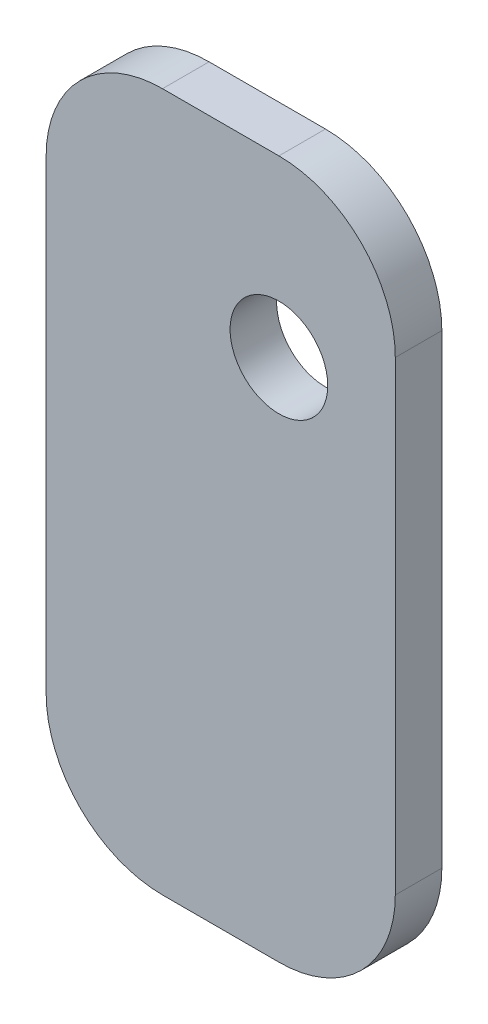
ISO-10303-21;
HEADER;
FILE_DESCRIPTION(('STEP AP214'),'2;1');
FILE_NAME('part.step','',(''),(''),'','','');
FILE_SCHEMA(('AUTOMOTIVE_DESIGN { 1 0 10303 214 1 1 1 1 }'));
ENDSEC;
DATA;
#1=APPLICATION_CONTEXT('core data for automotive mechanical design processes');
#2=APPLICATION_PROTOCOL_DEFINITION('international standard','automotive_design',2000,#1);
#3=PRODUCT_CONTEXT('',#1,'mechanical');
#4=PRODUCT('Part','Part','',(#3));
#5=PRODUCT_RELATED_PRODUCT_CATEGORY('part','',(#4));
#6=PRODUCT_DEFINITION_FORMATION('','',#4);
#7=PRODUCT_DEFINITION_CONTEXT('part definition',#1,'design');
#8=PRODUCT_DEFINITION('design','',#6,#7);
#9=PRODUCT_DEFINITION_SHAPE('','',#8);
#10=(LENGTH_UNIT() NAMED_UNIT(*) SI_UNIT(.MILLI.,.METRE.));
#11=(NAMED_UNIT(*) PLANE_ANGLE_UNIT() SI_UNIT($,.RADIAN.));
#12=(NAMED_UNIT(*) SI_UNIT($,.STERADIAN.) SOLID_ANGLE_UNIT());
#13=UNCERTAINTY_MEASURE_WITH_UNIT(LENGTH_MEASURE(1.E-05),#10,'distance_accuracy_value','');
#14=(GEOMETRIC_REPRESENTATION_CONTEXT(3) GLOBAL_UNCERTAINTY_ASSIGNED_CONTEXT((#13)) GLOBAL_UNIT_ASSIGNED_CONTEXT((#10,
#11,#12)) REPRESENTATION_CONTEXT('',''));
#15=CARTESIAN_POINT('',(0.,0.,0.));
#16=DIRECTION('',(0.,0.,1.));
#17=DIRECTION('',(1.,0.,0.));
#18=AXIS2_PLACEMENT_3D('',#15,#16,#17);
#19=CARTESIAN_POINT('',(-15.,-30.,4.));
#20=DIRECTION('',(1.,0.,0.));
#21=DIRECTION('',(0.,0.,-1.));
#22=AXIS2_PLACEMENT_3D('',#19,#20,#21);
#23=PLANE('',#22);
#24=DIRECTION('',(0.,-1.,0.));
#25=VECTOR('',#24,1.);
#26=CARTESIAN_POINT('',(-15.,-30.,4.));
#27=LINE('',#26,#25);
#28=CARTESIAN_POINT('',(-15.,20.,4.));
#29=VERTEX_POINT('',#28);
#30=CARTESIAN_POINT('',(-15.,-20.,4.));
#31=VERTEX_POINT('',#30);
#32=EDGE_CURVE('E118',#29,#31,#27,.T.);
#33=ORIENTED_EDGE('',*,*,#32,.F.);
#34=DIRECTION('',(0.,0.,-1.));
#35=VECTOR('',#34,1.);
#36=CARTESIAN_POINT('',(-15.,20.,4.));
#37=LINE('',#36,#35);
#38=CARTESIAN_POINT('',(-15.,20.,0.));
#39=VERTEX_POINT('',#38);
#40=EDGE_CURVE('E103',#29,#39,#37,.T.);
#41=ORIENTED_EDGE('',*,*,#40,.T.);
#42=DIRECTION('',(0.,-1.,0.));
#43=VECTOR('',#42,1.);
#44=CARTESIAN_POINT('',(-15.,-30.,0.));
#45=LINE('',#44,#43);
#46=CARTESIAN_POINT('',(-15.,-20.,0.));
#47=VERTEX_POINT('',#46);
#48=EDGE_CURVE('E115',#39,#47,#45,.T.);
#49=ORIENTED_EDGE('',*,*,#48,.T.);
#50=DIRECTION('',(0.,0.,-1.));
#51=VECTOR('',#50,1.);
#52=CARTESIAN_POINT('',(-15.,-20.,4.));
#53=LINE('',#52,#51);
#54=EDGE_CURVE('E120',#47,#31,#53,.F.);
#55=ORIENTED_EDGE('',*,*,#54,.T.);
#56=EDGE_LOOP('',(#33,#41,#49,#55));
#57=FACE_BOUND('',#56,.T.);
#58=ADVANCED_FACE('F33',(#57),#23,.F.);
#59=CARTESIAN_POINT('',(15.,-30.,4.));
#60=DIRECTION('',(0.,1.,0.));
#61=DIRECTION('',(0.,0.,1.));
#62=AXIS2_PLACEMENT_3D('',#59,#60,#61);
#63=PLANE('',#62);
#64=DIRECTION('',(1.,0.,0.));
#65=VECTOR('',#64,1.);
#66=CARTESIAN_POINT('',(15.,-30.,4.));
#67=LINE('',#66,#65);
#68=CARTESIAN_POINT('',(-5.,-30.,4.));
#69=VERTEX_POINT('',#68);
#70=CARTESIAN_POINT('',(5.,-30.,4.));
#71=VERTEX_POINT('',#70);
#72=EDGE_CURVE('E164',#69,#71,#67,.T.);
#73=ORIENTED_EDGE('',*,*,#72,.F.);
#74=DIRECTION('',(0.,0.,-1.));
#75=VECTOR('',#74,1.);
#76=CARTESIAN_POINT('',(-5.,-30.,4.));
#77=LINE('',#76,#75);
#78=CARTESIAN_POINT('',(-5.,-30.,0.));
#79=VERTEX_POINT('',#78);
#80=EDGE_CURVE('E157',#69,#79,#77,.T.);
#81=ORIENTED_EDGE('',*,*,#80,.T.);
#82=DIRECTION('',(1.,0.,0.));
#83=VECTOR('',#82,1.);
#84=CARTESIAN_POINT('',(15.,-30.,0.));
#85=LINE('',#84,#83);
#86=CARTESIAN_POINT('',(5.,-30.,0.));
#87=VERTEX_POINT('',#86);
#88=EDGE_CURVE('E124',#79,#87,#85,.T.);
#89=ORIENTED_EDGE('',*,*,#88,.T.);
#90=DIRECTION('',(0.,0.,-1.));
#91=VECTOR('',#90,1.);
#92=CARTESIAN_POINT('',(5.,-30.,4.));
#93=LINE('',#92,#91);
#94=EDGE_CURVE('E155',#87,#71,#93,.F.);
#95=ORIENTED_EDGE('',*,*,#94,.T.);
#96=EDGE_LOOP('',(#73,#81,#89,#95));
#97=FACE_BOUND('',#96,.T.);
#98=ADVANCED_FACE('F162',(#97),#63,.F.);
#99=CARTESIAN_POINT('',(15.,-30.,4.));
#100=DIRECTION('',(-1.,0.,0.));
#101=DIRECTION('',(0.,0.,1.));
#102=AXIS2_PLACEMENT_3D('',#99,#100,#101);
#103=PLANE('',#102);
#104=DIRECTION('',(0.,1.,0.));
#105=VECTOR('',#104,1.);
#106=CARTESIAN_POINT('',(15.,-30.,4.));
#107=LINE('',#106,#105);
#108=CARTESIAN_POINT('',(15.,-20.,4.));
#109=VERTEX_POINT('',#108);
#110=CARTESIAN_POINT('',(15.,20.,4.));
#111=VERTEX_POINT('',#110);
#112=EDGE_CURVE('E172',#109,#111,#107,.T.);
#113=ORIENTED_EDGE('',*,*,#112,.F.);
#114=DIRECTION('',(0.,0.,-1.));
#115=VECTOR('',#114,1.);
#116=CARTESIAN_POINT('',(15.,-20.,4.));
#117=LINE('',#116,#115);
#118=CARTESIAN_POINT('',(15.,-20.,0.));
#119=VERTEX_POINT('',#118);
#120=EDGE_CURVE('E11',#109,#119,#117,.T.);
#121=ORIENTED_EDGE('',*,*,#120,.T.);
#122=DIRECTION('',(0.,1.,0.));
#123=VECTOR('',#122,1.);
#124=CARTESIAN_POINT('',(15.,-30.,0.));
#125=LINE('',#124,#123);
#126=CARTESIAN_POINT('',(15.,20.,0.));
#127=VERTEX_POINT('',#126);
#128=EDGE_CURVE('E128',#119,#127,#125,.T.);
#129=ORIENTED_EDGE('',*,*,#128,.T.);
#130=DIRECTION('',(0.,0.,-1.));
#131=VECTOR('',#130,1.);
#132=CARTESIAN_POINT('',(15.,20.,4.));
#133=LINE('',#132,#131);
#134=EDGE_CURVE('E41',#127,#111,#133,.F.);
#135=ORIENTED_EDGE('',*,*,#134,.T.);
#136=EDGE_LOOP('',(#113,#121,#129,#135));
#137=FACE_BOUND('',#136,.T.);
#138=ADVANCED_FACE('F171',(#137),#103,.F.);
#139=CARTESIAN_POINT('',(15.,30.,4.));
#140=DIRECTION('',(0.,-1.,0.));
#141=DIRECTION('',(0.,0.,-1.));
#142=AXIS2_PLACEMENT_3D('',#139,#140,#141);
#143=PLANE('',#142);
#144=DIRECTION('',(-1.,0.,0.));
#145=VECTOR('',#144,1.);
#146=CARTESIAN_POINT('',(15.,30.,0.));
#147=LINE('',#146,#145);
#148=CARTESIAN_POINT('',(5.,30.,0.));
#149=VERTEX_POINT('',#148);
#150=CARTESIAN_POINT('',(-5.,30.,0.));
#151=VERTEX_POINT('',#150);
#152=EDGE_CURVE('E138',#149,#151,#147,.T.);
#153=ORIENTED_EDGE('',*,*,#152,.T.);
#154=DIRECTION('',(0.,0.,-1.));
#155=VECTOR('',#154,1.);
#156=CARTESIAN_POINT('',(-5.,30.,4.));
#157=LINE('',#156,#155);
#158=CARTESIAN_POINT('',(-5.,30.,4.));
#159=VERTEX_POINT('',#158);
#160=EDGE_CURVE('E104',#151,#159,#157,.F.);
#161=ORIENTED_EDGE('',*,*,#160,.T.);
#162=DIRECTION('',(-1.,0.,0.));
#163=VECTOR('',#162,1.);
#164=CARTESIAN_POINT('',(15.,30.,4.));
#165=LINE('',#164,#163);
#166=CARTESIAN_POINT('',(5.,30.,4.));
#167=VERTEX_POINT('',#166);
#168=EDGE_CURVE('E134',#167,#159,#165,.T.);
#169=ORIENTED_EDGE('',*,*,#168,.F.);
#170=DIRECTION('',(0.,0.,-1.));
#171=VECTOR('',#170,1.);
#172=CARTESIAN_POINT('',(5.,30.,4.));
#173=LINE('',#172,#171);
#174=EDGE_CURVE('E109',#167,#149,#173,.T.);
#175=ORIENTED_EDGE('',*,*,#174,.T.);
#176=EDGE_LOOP('',(#153,#161,#169,#175));
#177=FACE_BOUND('',#176,.T.);
#178=ADVANCED_FACE('F185',(#177),#143,.F.);
#179=CARTESIAN_POINT('',(0.,0.,4.));
#180=DIRECTION('',(0.,0.,1.));
#181=DIRECTION('',(1.,0.,0.));
#182=AXIS2_PLACEMENT_3D('',#179,#180,#181);
#183=PLANE('',#182);
#184=CARTESIAN_POINT('',(5.,15.,4.));
#185=DIRECTION('',(0.,0.,1.));
#186=DIRECTION('',(1.,0.,0.));
#187=AXIS2_PLACEMENT_3D('',#184,#185,#186);
#188=CIRCLE('',#187,4.1950936586854);
#189=CARTESIAN_POINT('',(9.1950936586854,15.,4.));
#190=VERTEX_POINT('',#189);
#191=EDGE_CURVE('E131',#190,#190,#188,.T.);
#192=ORIENTED_EDGE('',*,*,#191,.F.);
#193=EDGE_LOOP('',(#192));
#194=FACE_BOUND('',#193,.T.);
#195=ORIENTED_EDGE('',*,*,#168,.T.);
#196=CARTESIAN_POINT('',(-5.,20.,4.));
#197=DIRECTION('',(0.,0.,1.));
#198=DIRECTION('',(1.,0.,0.));
#199=AXIS2_PLACEMENT_3D('',#196,#197,#198);
#200=CIRCLE('',#199,10.);
#201=EDGE_CURVE('E153',#159,#29,#200,.T.);
#202=ORIENTED_EDGE('',*,*,#201,.T.);
#203=ORIENTED_EDGE('',*,*,#32,.T.);
#204=CARTESIAN_POINT('',(-5.,-20.,4.));
#205=DIRECTION('',(0.,0.,1.));
#206=DIRECTION('',(1.,0.,0.));
#207=AXIS2_PLACEMENT_3D('',#204,#205,#206);
#208=CIRCLE('',#207,10.);
#209=EDGE_CURVE('E151',#31,#69,#208,.T.);
#210=ORIENTED_EDGE('',*,*,#209,.T.);
#211=ORIENTED_EDGE('',*,*,#72,.T.);
#212=CARTESIAN_POINT('',(5.,-20.,4.));
#213=DIRECTION('',(0.,0.,1.));
#214=DIRECTION('',(1.,0.,0.));
#215=AXIS2_PLACEMENT_3D('',#212,#213,#214);
#216=CIRCLE('',#215,10.);
#217=EDGE_CURVE('E54',#71,#109,#216,.T.);
#218=ORIENTED_EDGE('',*,*,#217,.T.);
#219=ORIENTED_EDGE('',*,*,#112,.T.);
#220=CARTESIAN_POINT('',(5.,20.,4.));
#221=DIRECTION('',(0.,0.,1.));
#222=DIRECTION('',(1.,0.,0.));
#223=AXIS2_PLACEMENT_3D('',#220,#221,#222);
#224=CIRCLE('',#223,10.);
#225=EDGE_CURVE('E148',#111,#167,#224,.T.);
#226=ORIENTED_EDGE('',*,*,#225,.T.);
#227=EDGE_LOOP('',(#195,#202,#203,#210,#211,#218,#219,#226));
#228=FACE_BOUND('',#227,.T.);
#229=ADVANCED_FACE('F183',(#194,#228),#183,.T.);
#230=CARTESIAN_POINT('',(0.,0.,0.));
#231=DIRECTION('',(0.,0.,1.));
#232=DIRECTION('',(1.,0.,0.));
#233=AXIS2_PLACEMENT_3D('',#230,#231,#232);
#234=PLANE('',#233);
#235=CARTESIAN_POINT('',(5.,15.,0.));
#236=DIRECTION('',(0.,0.,1.));
#237=DIRECTION('',(1.,0.,0.));
#238=AXIS2_PLACEMENT_3D('',#235,#236,#237);
#239=CIRCLE('',#238,4.1950936586854);
#240=CARTESIAN_POINT('',(9.1950936586854,15.,0.));
#241=VERTEX_POINT('',#240);
#242=EDGE_CURVE('E125',#241,#241,#239,.T.);
#243=ORIENTED_EDGE('',*,*,#242,.T.);
#244=EDGE_LOOP('',(#243));
#245=FACE_BOUND('',#244,.T.);
#246=ORIENTED_EDGE('',*,*,#48,.F.);
#247=CARTESIAN_POINT('',(-5.,20.,0.));
#248=DIRECTION('',(0.,0.,1.));
#249=DIRECTION('',(1.,0.,0.));
#250=AXIS2_PLACEMENT_3D('',#247,#248,#249);
#251=CIRCLE('',#250,10.);
#252=EDGE_CURVE('E99',#39,#151,#251,.F.);
#253=ORIENTED_EDGE('',*,*,#252,.T.);
#254=ORIENTED_EDGE('',*,*,#152,.F.);
#255=CARTESIAN_POINT('',(5.,20.,0.));
#256=DIRECTION('',(0.,0.,1.));
#257=DIRECTION('',(1.,0.,0.));
#258=AXIS2_PLACEMENT_3D('',#255,#256,#257);
#259=CIRCLE('',#258,10.);
#260=EDGE_CURVE('E119',#149,#127,#259,.F.);
#261=ORIENTED_EDGE('',*,*,#260,.T.);
#262=ORIENTED_EDGE('',*,*,#128,.F.);
#263=CARTESIAN_POINT('',(5.,-20.,0.));
#264=DIRECTION('',(0.,0.,1.));
#265=DIRECTION('',(1.,0.,0.));
#266=AXIS2_PLACEMENT_3D('',#263,#264,#265);
#267=CIRCLE('',#266,10.);
#268=EDGE_CURVE('E142',#119,#87,#267,.F.);
#269=ORIENTED_EDGE('',*,*,#268,.T.);
#270=ORIENTED_EDGE('',*,*,#88,.F.);
#271=CARTESIAN_POINT('',(-5.,-20.,0.));
#272=DIRECTION('',(0.,0.,1.));
#273=DIRECTION('',(1.,0.,0.));
#274=AXIS2_PLACEMENT_3D('',#271,#272,#273);
#275=CIRCLE('',#274,10.);
#276=EDGE_CURVE('E110',#79,#47,#275,.F.);
#277=ORIENTED_EDGE('',*,*,#276,.T.);
#278=EDGE_LOOP('',(#246,#253,#254,#261,#262,#269,#270,#277));
#279=FACE_BOUND('',#278,.T.);
#280=ADVANCED_FACE('F122',(#245,#279),#234,.F.);
#281=CARTESIAN_POINT('',(5.,15.,0.));
#282=DIRECTION('',(0.,0.,1.));
#283=DIRECTION('',(1.,0.,0.));
#284=AXIS2_PLACEMENT_3D('',#281,#282,#283);
#285=CYLINDRICAL_SURFACE('',#284,4.1950936586854);
#286=ORIENTED_EDGE('',*,*,#242,.F.);
#287=EDGE_LOOP('',(#286));
#288=FACE_BOUND('',#287,.T.);
#289=ORIENTED_EDGE('',*,*,#191,.T.);
#290=EDGE_LOOP('',(#289));
#291=FACE_BOUND('',#290,.T.);
#292=ADVANCED_FACE('F181',(#288,#291),#285,.F.);
#293=CARTESIAN_POINT('',(-5.,20.,4.));
#294=DIRECTION('',(0.,0.,-1.));
#295=DIRECTION('',(-1.,0.,0.));
#296=AXIS2_PLACEMENT_3D('',#293,#294,#295);
#297=CYLINDRICAL_SURFACE('',#296,10.);
#298=ORIENTED_EDGE('',*,*,#201,.F.);
#299=ORIENTED_EDGE('',*,*,#160,.F.);
#300=ORIENTED_EDGE('',*,*,#252,.F.);
#301=ORIENTED_EDGE('',*,*,#40,.F.);
#302=EDGE_LOOP('',(#298,#299,#300,#301));
#303=FACE_BOUND('',#302,.T.);
#304=ADVANCED_FACE('F102',(#303),#297,.T.);
#305=CARTESIAN_POINT('',(-5.,-20.,4.));
#306=DIRECTION('',(0.,0.,-1.));
#307=DIRECTION('',(-1.,0.,0.));
#308=AXIS2_PLACEMENT_3D('',#305,#306,#307);
#309=CYLINDRICAL_SURFACE('',#308,10.);
#310=ORIENTED_EDGE('',*,*,#209,.F.);
#311=ORIENTED_EDGE('',*,*,#54,.F.);
#312=ORIENTED_EDGE('',*,*,#276,.F.);
#313=ORIENTED_EDGE('',*,*,#80,.F.);
#314=EDGE_LOOP('',(#310,#311,#312,#313));
#315=FACE_BOUND('',#314,.T.);
#316=ADVANCED_FACE('F195',(#315),#309,.T.);
#317=CARTESIAN_POINT('',(5.,-20.,4.));
#318=DIRECTION('',(0.,0.,-1.));
#319=DIRECTION('',(-1.,0.,0.));
#320=AXIS2_PLACEMENT_3D('',#317,#318,#319);
#321=CYLINDRICAL_SURFACE('',#320,10.);
#322=ORIENTED_EDGE('',*,*,#217,.F.);
#323=ORIENTED_EDGE('',*,*,#94,.F.);
#324=ORIENTED_EDGE('',*,*,#268,.F.);
#325=ORIENTED_EDGE('',*,*,#120,.F.);
#326=EDGE_LOOP('',(#322,#323,#324,#325));
#327=FACE_BOUND('',#326,.T.);
#328=ADVANCED_FACE('F170',(#327),#321,.T.);
#329=CARTESIAN_POINT('',(5.,20.,4.));
#330=DIRECTION('',(0.,0.,-1.));
#331=DIRECTION('',(-1.,0.,0.));
#332=AXIS2_PLACEMENT_3D('',#329,#330,#331);
#333=CYLINDRICAL_SURFACE('',#332,10.);
#334=ORIENTED_EDGE('',*,*,#225,.F.);
#335=ORIENTED_EDGE('',*,*,#134,.F.);
#336=ORIENTED_EDGE('',*,*,#260,.F.);
#337=ORIENTED_EDGE('',*,*,#174,.F.);
#338=EDGE_LOOP('',(#334,#335,#336,#337));
#339=FACE_BOUND('',#338,.T.);
#340=ADVANCED_FACE('F35',(#339),#333,.T.);
#341=CLOSED_SHELL('',(#58,#98,#138,#178,#229,#280,#292,#304,#316,#328,#340));
#342=MANIFOLD_SOLID_BREP('B2',#341);
#343=ADVANCED_BREP_SHAPE_REPRESENTATION('',(#18,#342),#14);
#344=SHAPE_DEFINITION_REPRESENTATION(#9,#343);
ENDSEC;
END-ISO-10303-21;
